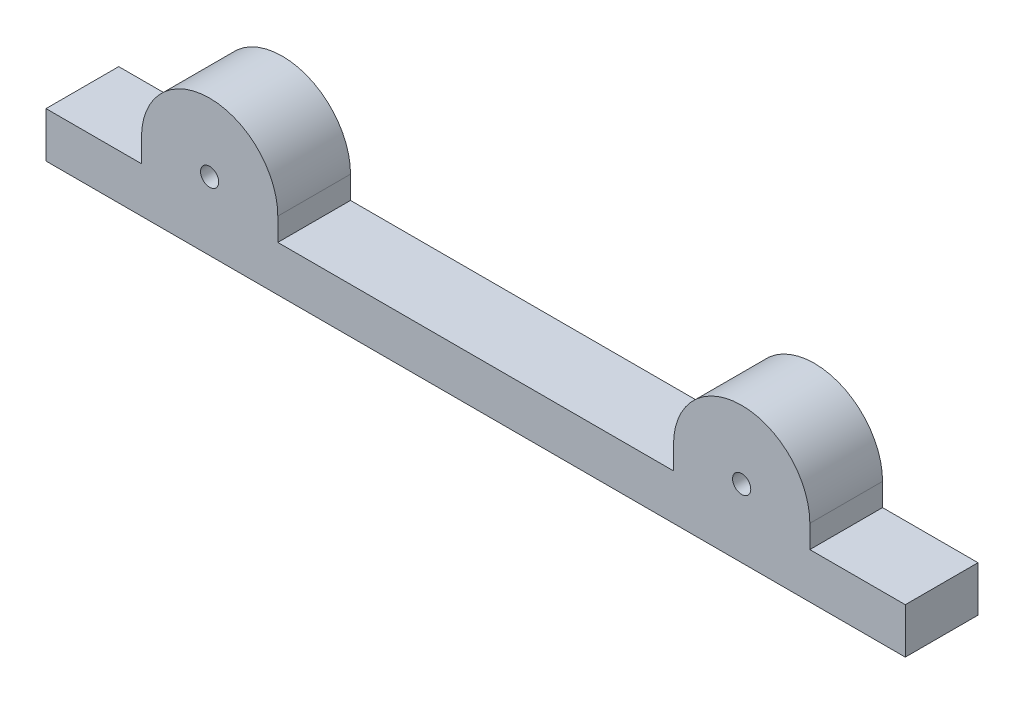
ISO-10303-21;
HEADER;
FILE_DESCRIPTION(('STEP AP214'),'2;1');
FILE_NAME('part.step','',(''),(''),'','','');
FILE_SCHEMA(('AUTOMOTIVE_DESIGN { 1 0 10303 214 1 1 1 1 }'));
ENDSEC;
DATA;
#1=APPLICATION_CONTEXT('core data for automotive mechanical design processes');
#2=APPLICATION_PROTOCOL_DEFINITION('international standard','automotive_design',2000,#1);
#3=PRODUCT_CONTEXT('',#1,'mechanical');
#4=PRODUCT('Part','Part','',(#3));
#5=PRODUCT_RELATED_PRODUCT_CATEGORY('part','',(#4));
#6=PRODUCT_DEFINITION_FORMATION('','',#4);
#7=PRODUCT_DEFINITION_CONTEXT('part definition',#1,'design');
#8=PRODUCT_DEFINITION('design','',#6,#7);
#9=PRODUCT_DEFINITION_SHAPE('','',#8);
#10=(LENGTH_UNIT() NAMED_UNIT(*) SI_UNIT(.MILLI.,.METRE.));
#11=(NAMED_UNIT(*) PLANE_ANGLE_UNIT() SI_UNIT($,.RADIAN.));
#12=(NAMED_UNIT(*) SI_UNIT($,.STERADIAN.) SOLID_ANGLE_UNIT());
#13=UNCERTAINTY_MEASURE_WITH_UNIT(LENGTH_MEASURE(1.E-05),#10,'distance_accuracy_value','');
#14=(GEOMETRIC_REPRESENTATION_CONTEXT(3) GLOBAL_UNCERTAINTY_ASSIGNED_CONTEXT((#13)) GLOBAL_UNIT_ASSIGNED_CONTEXT((#10,
#11,#12)) REPRESENTATION_CONTEXT('',''));
#15=CARTESIAN_POINT('',(0.,0.,0.));
#16=DIRECTION('',(0.,0.,1.));
#17=DIRECTION('',(1.,0.,0.));
#18=AXIS2_PLACEMENT_3D('',#15,#16,#17);
#19=CARTESIAN_POINT('',(43.51782,4.7625,5.08));
#20=DIRECTION('',(0.,0.,1.));
#21=DIRECTION('',(1.,0.,0.));
#22=AXIS2_PLACEMENT_3D('',#19,#20,#21);
#23=PLANE('',#22);
#24=CARTESIAN_POINT('',(6.35,4.7625,5.08));
#25=DIRECTION('',(0.,0.,1.));
#26=DIRECTION('',(1.,0.,0.));
#27=AXIS2_PLACEMENT_3D('',#24,#25,#26);
#28=CIRCLE('',#27,0.635000000000001);
#29=CARTESIAN_POINT('',(6.985,4.7625,5.08));
#30=VERTEX_POINT('',#29);
#31=EDGE_CURVE('E156',#30,#30,#28,.T.);
#32=ORIENTED_EDGE('',*,*,#31,.F.);
#33=EDGE_LOOP('',(#32));
#34=FACE_BOUND('',#33,.T.);
#35=DIRECTION('',(1.,0.,0.));
#36=VECTOR('',#35,1.);
#37=CARTESIAN_POINT('',(-5.08,0.,5.08));
#38=LINE('',#37,#36);
#39=CARTESIAN_POINT('',(-5.08,0.,5.08));
#40=VERTEX_POINT('',#39);
#41=CARTESIAN_POINT('',(54.94782,0.,5.08));
#42=VERTEX_POINT('',#41);
#43=EDGE_CURVE('E103',#40,#42,#38,.T.);
#44=ORIENTED_EDGE('',*,*,#43,.T.);
#45=DIRECTION('',(0.,1.,0.));
#46=VECTOR('',#45,1.);
#47=CARTESIAN_POINT('',(54.94782,3.175,5.08));
#48=LINE('',#47,#46);
#49=CARTESIAN_POINT('',(54.94782,3.175,5.08));
#50=VERTEX_POINT('',#49);
#51=EDGE_CURVE('E208',#42,#50,#48,.T.);
#52=ORIENTED_EDGE('',*,*,#51,.T.);
#53=DIRECTION('',(-1.,0.,0.));
#54=VECTOR('',#53,1.);
#55=CARTESIAN_POINT('',(49.86782,3.175,5.08));
#56=LINE('',#55,#54);
#57=CARTESIAN_POINT('',(48.28032,3.175,5.08));
#58=VERTEX_POINT('',#57);
#59=EDGE_CURVE('E204',#50,#58,#56,.T.);
#60=ORIENTED_EDGE('',*,*,#59,.T.);
#61=DIRECTION('',(0.,1.,0.));
#62=VECTOR('',#61,1.);
#63=CARTESIAN_POINT('',(48.28032,4.7625,5.08));
#64=LINE('',#63,#62);
#65=CARTESIAN_POINT('',(48.28032,4.7625,5.08));
#66=VERTEX_POINT('',#65);
#67=EDGE_CURVE('E225',#58,#66,#64,.T.);
#68=ORIENTED_EDGE('',*,*,#67,.T.);
#69=CARTESIAN_POINT('',(43.51782,4.7625,5.08));
#70=DIRECTION('',(0.,0.,1.));
#71=DIRECTION('',(1.,0.,0.));
#72=AXIS2_PLACEMENT_3D('',#69,#70,#71);
#73=CIRCLE('',#72,4.7625);
#74=CARTESIAN_POINT('',(38.75532,4.7625,5.08));
#75=VERTEX_POINT('',#74);
#76=EDGE_CURVE('E222',#66,#75,#73,.T.);
#77=ORIENTED_EDGE('',*,*,#76,.T.);
#78=DIRECTION('',(0.,-1.,0.));
#79=VECTOR('',#78,1.);
#80=CARTESIAN_POINT('',(38.75532,3.175,5.08));
#81=LINE('',#80,#79);
#82=CARTESIAN_POINT('',(38.75532,3.175,5.08));
#83=VERTEX_POINT('',#82);
#84=EDGE_CURVE('E224',#75,#83,#81,.T.);
#85=ORIENTED_EDGE('',*,*,#84,.T.);
#86=DIRECTION('',(-1.,0.,0.));
#87=VECTOR('',#86,1.);
#88=CARTESIAN_POINT('',(11.1125,3.175,5.08));
#89=LINE('',#88,#87);
#90=CARTESIAN_POINT('',(11.1125,3.175,5.08));
#91=VERTEX_POINT('',#90);
#92=EDGE_CURVE('E227',#83,#91,#89,.T.);
#93=ORIENTED_EDGE('',*,*,#92,.T.);
#94=DIRECTION('',(0.,1.,0.));
#95=VECTOR('',#94,1.);
#96=CARTESIAN_POINT('',(11.1125,4.7625,5.08));
#97=LINE('',#96,#95);
#98=CARTESIAN_POINT('',(11.1125,4.7625,5.08));
#99=VERTEX_POINT('',#98);
#100=EDGE_CURVE('E233',#91,#99,#97,.T.);
#101=ORIENTED_EDGE('',*,*,#100,.T.);
#102=CARTESIAN_POINT('',(6.35,4.7625,5.08));
#103=DIRECTION('',(0.,0.,1.));
#104=DIRECTION('',(-1.,0.,0.));
#105=AXIS2_PLACEMENT_3D('',#102,#103,#104);
#106=CIRCLE('',#105,4.7625);
#107=CARTESIAN_POINT('',(1.5875,4.7625,5.08));
#108=VERTEX_POINT('',#107);
#109=EDGE_CURVE('E135',#99,#108,#106,.T.);
#110=ORIENTED_EDGE('',*,*,#109,.T.);
#111=DIRECTION('',(0.,-1.,0.));
#112=VECTOR('',#111,1.);
#113=CARTESIAN_POINT('',(1.5875,3.175,5.08));
#114=LINE('',#113,#112);
#115=CARTESIAN_POINT('',(1.5875,3.175,5.08));
#116=VERTEX_POINT('',#115);
#117=EDGE_CURVE('E129',#108,#116,#114,.T.);
#118=ORIENTED_EDGE('',*,*,#117,.T.);
#119=DIRECTION('',(-1.,0.,0.));
#120=VECTOR('',#119,1.);
#121=CARTESIAN_POINT('',(0.,3.175,5.08));
#122=LINE('',#121,#120);
#123=CARTESIAN_POINT('',(-5.08,3.175,5.08));
#124=VERTEX_POINT('',#123);
#125=EDGE_CURVE('E133',#116,#124,#122,.T.);
#126=ORIENTED_EDGE('',*,*,#125,.T.);
#127=DIRECTION('',(0.,-1.,0.));
#128=VECTOR('',#127,1.);
#129=CARTESIAN_POINT('',(-5.08,3.175,5.08));
#130=LINE('',#129,#128);
#131=EDGE_CURVE('E50',#124,#40,#130,.T.);
#132=ORIENTED_EDGE('',*,*,#131,.T.);
#133=EDGE_LOOP('',(#44,#52,#60,#68,#77,#85,#93,#101,#110,#118,#126,#132));
#134=FACE_BOUND('',#133,.T.);
#135=CARTESIAN_POINT('',(43.51782,4.7625,5.08));
#136=DIRECTION('',(0.,0.,1.));
#137=DIRECTION('',(1.,0.,0.));
#138=AXIS2_PLACEMENT_3D('',#135,#136,#137);
#139=CIRCLE('',#138,0.634999999999995);
#140=CARTESIAN_POINT('',(44.15282,4.7625,5.08));
#141=VERTEX_POINT('',#140);
#142=EDGE_CURVE('E253',#141,#141,#139,.T.);
#143=ORIENTED_EDGE('',*,*,#142,.F.);
#144=EDGE_LOOP('',(#143));
#145=FACE_BOUND('',#144,.T.);
#146=ADVANCED_FACE('F33',(#34,#134,#145),#23,.T.);
#147=CARTESIAN_POINT('',(43.51782,4.7625,0.));
#148=DIRECTION('',(0.,0.,1.));
#149=DIRECTION('',(1.,0.,0.));
#150=AXIS2_PLACEMENT_3D('',#147,#148,#149);
#151=PLANE('',#150);
#152=CARTESIAN_POINT('',(6.35,4.7625,0.));
#153=DIRECTION('',(0.,0.,1.));
#154=DIRECTION('',(1.,0.,0.));
#155=AXIS2_PLACEMENT_3D('',#152,#153,#154);
#156=CIRCLE('',#155,0.635000000000001);
#157=CARTESIAN_POINT('',(6.985,4.7625,0.));
#158=VERTEX_POINT('',#157);
#159=EDGE_CURVE('E250',#158,#158,#156,.T.);
#160=ORIENTED_EDGE('',*,*,#159,.T.);
#161=EDGE_LOOP('',(#160));
#162=FACE_BOUND('',#161,.T.);
#163=DIRECTION('',(1.,0.,0.));
#164=VECTOR('',#163,1.);
#165=CARTESIAN_POINT('',(54.94782,0.,0.));
#166=LINE('',#165,#164);
#167=CARTESIAN_POINT('',(-5.08,0.,0.));
#168=VERTEX_POINT('',#167);
#169=CARTESIAN_POINT('',(54.94782,0.,0.));
#170=VERTEX_POINT('',#169);
#171=EDGE_CURVE('E97',#168,#170,#166,.T.);
#172=ORIENTED_EDGE('',*,*,#171,.F.);
#173=DIRECTION('',(0.,-1.,0.));
#174=VECTOR('',#173,1.);
#175=CARTESIAN_POINT('',(-5.08,3.175,0.));
#176=LINE('',#175,#174);
#177=CARTESIAN_POINT('',(-5.08,3.175,0.));
#178=VERTEX_POINT('',#177);
#179=EDGE_CURVE('E175',#178,#168,#176,.T.);
#180=ORIENTED_EDGE('',*,*,#179,.F.);
#181=DIRECTION('',(-1.,0.,0.));
#182=VECTOR('',#181,1.);
#183=CARTESIAN_POINT('',(0.,3.175,0.));
#184=LINE('',#183,#182);
#185=CARTESIAN_POINT('',(1.5875,3.175,0.));
#186=VERTEX_POINT('',#185);
#187=EDGE_CURVE('E90',#186,#178,#184,.T.);
#188=ORIENTED_EDGE('',*,*,#187,.F.);
#189=DIRECTION('',(0.,-1.,0.));
#190=VECTOR('',#189,1.);
#191=CARTESIAN_POINT('',(1.5875,3.175,0.));
#192=LINE('',#191,#190);
#193=CARTESIAN_POINT('',(1.5875,4.7625,0.));
#194=VERTEX_POINT('',#193);
#195=EDGE_CURVE('E144',#194,#186,#192,.T.);
#196=ORIENTED_EDGE('',*,*,#195,.F.);
#197=CARTESIAN_POINT('',(6.35,4.7625,0.));
#198=DIRECTION('',(0.,0.,1.));
#199=DIRECTION('',(-1.,0.,0.));
#200=AXIS2_PLACEMENT_3D('',#197,#198,#199);
#201=CIRCLE('',#200,4.7625);
#202=CARTESIAN_POINT('',(11.1125,4.7625,0.));
#203=VERTEX_POINT('',#202);
#204=EDGE_CURVE('E171',#203,#194,#201,.T.);
#205=ORIENTED_EDGE('',*,*,#204,.F.);
#206=DIRECTION('',(0.,1.,0.));
#207=VECTOR('',#206,1.);
#208=CARTESIAN_POINT('',(11.1125,4.7625,0.));
#209=LINE('',#208,#207);
#210=CARTESIAN_POINT('',(11.1125,3.175,0.));
#211=VERTEX_POINT('',#210);
#212=EDGE_CURVE('E169',#211,#203,#209,.T.);
#213=ORIENTED_EDGE('',*,*,#212,.F.);
#214=DIRECTION('',(-1.,0.,0.));
#215=VECTOR('',#214,1.);
#216=CARTESIAN_POINT('',(11.1125,3.175,0.));
#217=LINE('',#216,#215);
#218=CARTESIAN_POINT('',(38.75532,3.175,0.));
#219=VERTEX_POINT('',#218);
#220=EDGE_CURVE('E167',#219,#211,#217,.T.);
#221=ORIENTED_EDGE('',*,*,#220,.F.);
#222=DIRECTION('',(0.,-1.,0.));
#223=VECTOR('',#222,1.);
#224=CARTESIAN_POINT('',(38.75532,3.175,0.));
#225=LINE('',#224,#223);
#226=CARTESIAN_POINT('',(38.75532,4.7625,0.));
#227=VERTEX_POINT('',#226);
#228=EDGE_CURVE('E165',#227,#219,#225,.T.);
#229=ORIENTED_EDGE('',*,*,#228,.F.);
#230=CARTESIAN_POINT('',(43.51782,4.7625,0.));
#231=DIRECTION('',(0.,0.,1.));
#232=DIRECTION('',(1.,0.,0.));
#233=AXIS2_PLACEMENT_3D('',#230,#231,#232);
#234=CIRCLE('',#233,4.7625);
#235=CARTESIAN_POINT('',(48.28032,4.7625,0.));
#236=VERTEX_POINT('',#235);
#237=EDGE_CURVE('E163',#236,#227,#234,.T.);
#238=ORIENTED_EDGE('',*,*,#237,.F.);
#239=DIRECTION('',(0.,1.,0.));
#240=VECTOR('',#239,1.);
#241=CARTESIAN_POINT('',(48.28032,4.7625,0.));
#242=LINE('',#241,#240);
#243=CARTESIAN_POINT('',(48.28032,3.175,0.));
#244=VERTEX_POINT('',#243);
#245=EDGE_CURVE('E161',#244,#236,#242,.T.);
#246=ORIENTED_EDGE('',*,*,#245,.F.);
#247=DIRECTION('',(-1.,0.,0.));
#248=VECTOR('',#247,1.);
#249=CARTESIAN_POINT('',(48.28032,3.175,0.));
#250=LINE('',#249,#248);
#251=CARTESIAN_POINT('',(54.94782,3.175,0.));
#252=VERTEX_POINT('',#251);
#253=EDGE_CURVE('E159',#252,#244,#250,.T.);
#254=ORIENTED_EDGE('',*,*,#253,.F.);
#255=DIRECTION('',(0.,1.,0.));
#256=VECTOR('',#255,1.);
#257=CARTESIAN_POINT('',(54.94782,3.175,0.));
#258=LINE('',#257,#256);
#259=EDGE_CURVE('E155',#170,#252,#258,.T.);
#260=ORIENTED_EDGE('',*,*,#259,.F.);
#261=EDGE_LOOP('',(#172,#180,#188,#196,#205,#213,#221,#229,#238,#246,#254,#260));
#262=FACE_BOUND('',#261,.T.);
#263=CARTESIAN_POINT('',(43.51782,4.7625,0.));
#264=DIRECTION('',(0.,0.,1.));
#265=DIRECTION('',(1.,0.,0.));
#266=AXIS2_PLACEMENT_3D('',#263,#264,#265);
#267=CIRCLE('',#266,0.634999999999995);
#268=CARTESIAN_POINT('',(44.15282,4.7625,0.));
#269=VERTEX_POINT('',#268);
#270=EDGE_CURVE('E256',#269,#269,#267,.T.);
#271=ORIENTED_EDGE('',*,*,#270,.T.);
#272=EDGE_LOOP('',(#271));
#273=FACE_BOUND('',#272,.T.);
#274=ADVANCED_FACE('F209',(#162,#262,#273),#151,.F.);
#275=CARTESIAN_POINT('',(54.94782,0.,5.08));
#276=DIRECTION('',(0.,1.,0.));
#277=DIRECTION('',(-1.,0.,0.));
#278=AXIS2_PLACEMENT_3D('',#275,#276,#277);
#279=PLANE('',#278);
#280=ORIENTED_EDGE('',*,*,#171,.T.);
#281=DIRECTION('',(0.,0.,-1.));
#282=VECTOR('',#281,1.);
#283=CARTESIAN_POINT('',(54.94782,0.,5.08));
#284=LINE('',#283,#282);
#285=EDGE_CURVE('E11',#42,#170,#284,.T.);
#286=ORIENTED_EDGE('',*,*,#285,.F.);
#287=ORIENTED_EDGE('',*,*,#43,.F.);
#288=DIRECTION('',(0.,0.,-1.));
#289=VECTOR('',#288,1.);
#290=CARTESIAN_POINT('',(-5.08,0.,5.08));
#291=LINE('',#290,#289);
#292=EDGE_CURVE('E150',#40,#168,#291,.T.);
#293=ORIENTED_EDGE('',*,*,#292,.T.);
#294=EDGE_LOOP('',(#280,#286,#287,#293));
#295=FACE_BOUND('',#294,.T.);
#296=ADVANCED_FACE('F35',(#295),#279,.F.);
#297=CARTESIAN_POINT('',(54.94782,3.175,5.08));
#298=DIRECTION('',(-1.,0.,0.));
#299=DIRECTION('',(0.,0.,1.));
#300=AXIS2_PLACEMENT_3D('',#297,#298,#299);
#301=PLANE('',#300);
#302=ORIENTED_EDGE('',*,*,#259,.T.);
#303=DIRECTION('',(0.,0.,-1.));
#304=VECTOR('',#303,1.);
#305=CARTESIAN_POINT('',(54.94782,3.175,5.08));
#306=LINE('',#305,#304);
#307=EDGE_CURVE('E42',#50,#252,#306,.T.);
#308=ORIENTED_EDGE('',*,*,#307,.F.);
#309=ORIENTED_EDGE('',*,*,#51,.F.);
#310=ORIENTED_EDGE('',*,*,#285,.T.);
#311=EDGE_LOOP('',(#302,#308,#309,#310));
#312=FACE_BOUND('',#311,.T.);
#313=ADVANCED_FACE('F207',(#312),#301,.F.);
#314=CARTESIAN_POINT('',(48.28032,3.175,5.08));
#315=DIRECTION('',(0.,-1.,0.));
#316=DIRECTION('',(0.,0.,-1.));
#317=AXIS2_PLACEMENT_3D('',#314,#315,#316);
#318=PLANE('',#317);
#319=ORIENTED_EDGE('',*,*,#253,.T.);
#320=DIRECTION('',(0.,0.,-1.));
#321=VECTOR('',#320,1.);
#322=CARTESIAN_POINT('',(48.28032,3.175,5.08));
#323=LINE('',#322,#321);
#324=EDGE_CURVE('E196',#58,#244,#323,.T.);
#325=ORIENTED_EDGE('',*,*,#324,.F.);
#326=ORIENTED_EDGE('',*,*,#59,.F.);
#327=ORIENTED_EDGE('',*,*,#307,.T.);
#328=EDGE_LOOP('',(#319,#325,#326,#327));
#329=FACE_BOUND('',#328,.T.);
#330=ADVANCED_FACE('F202',(#329),#318,.F.);
#331=CARTESIAN_POINT('',(48.28032,4.7625,5.08));
#332=DIRECTION('',(-1.,0.,0.));
#333=DIRECTION('',(0.,-1.,0.));
#334=AXIS2_PLACEMENT_3D('',#331,#332,#333);
#335=PLANE('',#334);
#336=ORIENTED_EDGE('',*,*,#245,.T.);
#337=DIRECTION('',(0.,0.,-1.));
#338=VECTOR('',#337,1.);
#339=CARTESIAN_POINT('',(48.28032,4.7625,5.08));
#340=LINE('',#339,#338);
#341=EDGE_CURVE('E193',#66,#236,#340,.T.);
#342=ORIENTED_EDGE('',*,*,#341,.F.);
#343=ORIENTED_EDGE('',*,*,#67,.F.);
#344=ORIENTED_EDGE('',*,*,#324,.T.);
#345=EDGE_LOOP('',(#336,#342,#343,#344));
#346=FACE_BOUND('',#345,.T.);
#347=ADVANCED_FACE('F216',(#346),#335,.F.);
#348=CARTESIAN_POINT('',(43.51782,4.7625,5.08));
#349=DIRECTION('',(0.,0.,-1.));
#350=DIRECTION('',(-1.,0.,0.));
#351=AXIS2_PLACEMENT_3D('',#348,#349,#350);
#352=CYLINDRICAL_SURFACE('',#351,4.7625);
#353=ORIENTED_EDGE('',*,*,#237,.T.);
#354=DIRECTION('',(0.,0.,-1.));
#355=VECTOR('',#354,1.);
#356=CARTESIAN_POINT('',(38.75532,4.7625,5.08));
#357=LINE('',#356,#355);
#358=EDGE_CURVE('E190',#75,#227,#357,.T.);
#359=ORIENTED_EDGE('',*,*,#358,.F.);
#360=ORIENTED_EDGE('',*,*,#76,.F.);
#361=ORIENTED_EDGE('',*,*,#341,.T.);
#362=EDGE_LOOP('',(#353,#359,#360,#361));
#363=FACE_BOUND('',#362,.T.);
#364=ADVANCED_FACE('F220',(#363),#352,.T.);
#365=CARTESIAN_POINT('',(38.75532,3.175,5.08));
#366=DIRECTION('',(1.,0.,0.));
#367=DIRECTION('',(0.,0.,-1.));
#368=AXIS2_PLACEMENT_3D('',#365,#366,#367);
#369=PLANE('',#368);
#370=ORIENTED_EDGE('',*,*,#228,.T.);
#371=DIRECTION('',(0.,0.,-1.));
#372=VECTOR('',#371,1.);
#373=CARTESIAN_POINT('',(38.75532,3.175,5.08));
#374=LINE('',#373,#372);
#375=EDGE_CURVE('E187',#83,#219,#374,.T.);
#376=ORIENTED_EDGE('',*,*,#375,.F.);
#377=ORIENTED_EDGE('',*,*,#84,.F.);
#378=ORIENTED_EDGE('',*,*,#358,.T.);
#379=EDGE_LOOP('',(#370,#376,#377,#378));
#380=FACE_BOUND('',#379,.T.);
#381=ADVANCED_FACE('F290',(#380),#369,.F.);
#382=CARTESIAN_POINT('',(11.1125,3.175,5.08));
#383=DIRECTION('',(0.,-1.,0.));
#384=DIRECTION('',(1.,0.,0.));
#385=AXIS2_PLACEMENT_3D('',#382,#383,#384);
#386=PLANE('',#385);
#387=ORIENTED_EDGE('',*,*,#220,.T.);
#388=DIRECTION('',(0.,0.,-1.));
#389=VECTOR('',#388,1.);
#390=CARTESIAN_POINT('',(11.1125,3.175,5.08));
#391=LINE('',#390,#389);
#392=EDGE_CURVE('E184',#91,#211,#391,.T.);
#393=ORIENTED_EDGE('',*,*,#392,.F.);
#394=ORIENTED_EDGE('',*,*,#92,.F.);
#395=ORIENTED_EDGE('',*,*,#375,.T.);
#396=EDGE_LOOP('',(#387,#393,#394,#395));
#397=FACE_BOUND('',#396,.T.);
#398=ADVANCED_FACE('F287',(#397),#386,.F.);
#399=CARTESIAN_POINT('',(11.1125,4.7625,5.08));
#400=DIRECTION('',(-1.,0.,0.));
#401=DIRECTION('',(0.,0.,1.));
#402=AXIS2_PLACEMENT_3D('',#399,#400,#401);
#403=PLANE('',#402);
#404=ORIENTED_EDGE('',*,*,#212,.T.);
#405=DIRECTION('',(0.,0.,-1.));
#406=VECTOR('',#405,1.);
#407=CARTESIAN_POINT('',(11.1125,4.7625,5.08));
#408=LINE('',#407,#406);
#409=EDGE_CURVE('E181',#99,#203,#408,.T.);
#410=ORIENTED_EDGE('',*,*,#409,.F.);
#411=ORIENTED_EDGE('',*,*,#100,.F.);
#412=ORIENTED_EDGE('',*,*,#392,.T.);
#413=EDGE_LOOP('',(#404,#410,#411,#412));
#414=FACE_BOUND('',#413,.T.);
#415=ADVANCED_FACE('F239',(#414),#403,.F.);
#416=CARTESIAN_POINT('',(6.35,4.7625,5.08));
#417=DIRECTION('',(0.,0.,-1.));
#418=DIRECTION('',(-1.,0.,0.));
#419=AXIS2_PLACEMENT_3D('',#416,#417,#418);
#420=CYLINDRICAL_SURFACE('',#419,4.7625);
#421=ORIENTED_EDGE('',*,*,#204,.T.);
#422=DIRECTION('',(0.,0.,-1.));
#423=VECTOR('',#422,1.);
#424=CARTESIAN_POINT('',(1.5875,4.7625,5.08));
#425=LINE('',#424,#423);
#426=EDGE_CURVE('E145',#108,#194,#425,.T.);
#427=ORIENTED_EDGE('',*,*,#426,.F.);
#428=ORIENTED_EDGE('',*,*,#109,.F.);
#429=ORIENTED_EDGE('',*,*,#409,.T.);
#430=EDGE_LOOP('',(#421,#427,#428,#429));
#431=FACE_BOUND('',#430,.T.);
#432=ADVANCED_FACE('F243',(#431),#420,.T.);
#433=CARTESIAN_POINT('',(1.5875,3.175,5.08));
#434=DIRECTION('',(1.,0.,0.));
#435=DIRECTION('',(0.,0.,-1.));
#436=AXIS2_PLACEMENT_3D('',#433,#434,#435);
#437=PLANE('',#436);
#438=ORIENTED_EDGE('',*,*,#195,.T.);
#439=DIRECTION('',(0.,0.,-1.));
#440=VECTOR('',#439,1.);
#441=CARTESIAN_POINT('',(1.5875,3.175,5.08));
#442=LINE('',#441,#440);
#443=EDGE_CURVE('E141',#116,#186,#442,.T.);
#444=ORIENTED_EDGE('',*,*,#443,.F.);
#445=ORIENTED_EDGE('',*,*,#117,.F.);
#446=ORIENTED_EDGE('',*,*,#426,.T.);
#447=EDGE_LOOP('',(#438,#444,#445,#446));
#448=FACE_BOUND('',#447,.T.);
#449=ADVANCED_FACE('F142',(#448),#437,.F.);
#450=CARTESIAN_POINT('',(0.,3.175,5.08));
#451=DIRECTION('',(0.,-1.,0.));
#452=DIRECTION('',(1.,0.,0.));
#453=AXIS2_PLACEMENT_3D('',#450,#451,#452);
#454=PLANE('',#453);
#455=ORIENTED_EDGE('',*,*,#187,.T.);
#456=DIRECTION('',(0.,0.,-1.));
#457=VECTOR('',#456,1.);
#458=CARTESIAN_POINT('',(-5.08,3.175,5.08));
#459=LINE('',#458,#457);
#460=EDGE_CURVE('E146',#124,#178,#459,.T.);
#461=ORIENTED_EDGE('',*,*,#460,.F.);
#462=ORIENTED_EDGE('',*,*,#125,.F.);
#463=ORIENTED_EDGE('',*,*,#443,.T.);
#464=EDGE_LOOP('',(#455,#461,#462,#463));
#465=FACE_BOUND('',#464,.T.);
#466=ADVANCED_FACE('F148',(#465),#454,.F.);
#467=CARTESIAN_POINT('',(-5.08,3.175,5.08));
#468=DIRECTION('',(1.,0.,0.));
#469=DIRECTION('',(0.,1.,0.));
#470=AXIS2_PLACEMENT_3D('',#467,#468,#469);
#471=PLANE('',#470);
#472=ORIENTED_EDGE('',*,*,#179,.T.);
#473=ORIENTED_EDGE('',*,*,#292,.F.);
#474=ORIENTED_EDGE('',*,*,#131,.F.);
#475=ORIENTED_EDGE('',*,*,#460,.T.);
#476=EDGE_LOOP('',(#472,#473,#474,#475));
#477=FACE_BOUND('',#476,.T.);
#478=ADVANCED_FACE('F245',(#477),#471,.F.);
#479=CARTESIAN_POINT('',(6.35,4.7625,5.08));
#480=DIRECTION('',(0.,0.,-1.));
#481=DIRECTION('',(-1.,0.,0.));
#482=AXIS2_PLACEMENT_3D('',#479,#480,#481);
#483=CYLINDRICAL_SURFACE('',#482,0.635000000000001);
#484=ORIENTED_EDGE('',*,*,#31,.T.);
#485=EDGE_LOOP('',(#484));
#486=FACE_BOUND('',#485,.T.);
#487=ORIENTED_EDGE('',*,*,#159,.F.);
#488=EDGE_LOOP('',(#487));
#489=FACE_BOUND('',#488,.T.);
#490=ADVANCED_FACE('F274',(#486,#489),#483,.F.);
#491=CARTESIAN_POINT('',(43.51782,4.7625,5.08));
#492=DIRECTION('',(0.,0.,-1.));
#493=DIRECTION('',(-1.,0.,0.));
#494=AXIS2_PLACEMENT_3D('',#491,#492,#493);
#495=CYLINDRICAL_SURFACE('',#494,0.634999999999995);
#496=ORIENTED_EDGE('',*,*,#142,.T.);
#497=EDGE_LOOP('',(#496));
#498=FACE_BOUND('',#497,.T.);
#499=ORIENTED_EDGE('',*,*,#270,.F.);
#500=EDGE_LOOP('',(#499));
#501=FACE_BOUND('',#500,.T.);
#502=ADVANCED_FACE('F262',(#498,#501),#495,.F.);
#503=CLOSED_SHELL('',(#146,#274,#296,#313,#330,#347,#364,#381,#398,#415,#432,#449,#466,#478,
#490,#502));
#504=MANIFOLD_SOLID_BREP('B2',#503);
#505=ADVANCED_BREP_SHAPE_REPRESENTATION('',(#18,#504),#14);
#506=SHAPE_DEFINITION_REPRESENTATION(#9,#505);
ENDSEC;
END-ISO-10303-21;
